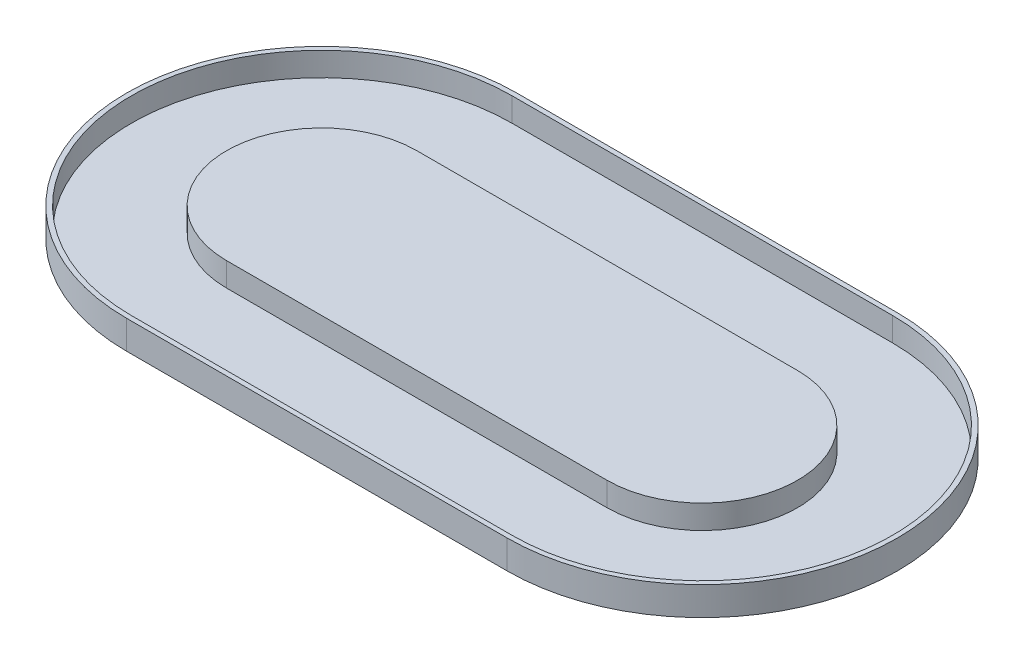
ISO-10303-21;
HEADER;
FILE_DESCRIPTION(('STEP AP214'),'2;1');
FILE_NAME('part.step','',(''),(''),'','','');
FILE_SCHEMA(('AUTOMOTIVE_DESIGN { 1 0 10303 214 1 1 1 1 }'));
ENDSEC;
DATA;
#1=APPLICATION_CONTEXT('core data for automotive mechanical design processes');
#2=APPLICATION_PROTOCOL_DEFINITION('international standard','automotive_design',2000,#1);
#3=PRODUCT_CONTEXT('',#1,'mechanical');
#4=PRODUCT('Part','Part','',(#3));
#5=PRODUCT_RELATED_PRODUCT_CATEGORY('part','',(#4));
#6=PRODUCT_DEFINITION_FORMATION('','',#4);
#7=PRODUCT_DEFINITION_CONTEXT('part definition',#1,'design');
#8=PRODUCT_DEFINITION('design','',#6,#7);
#9=PRODUCT_DEFINITION_SHAPE('','',#8);
#10=(LENGTH_UNIT() NAMED_UNIT(*) SI_UNIT(.MILLI.,.METRE.));
#11=(NAMED_UNIT(*) PLANE_ANGLE_UNIT() SI_UNIT($,.RADIAN.));
#12=(NAMED_UNIT(*) SI_UNIT($,.STERADIAN.) SOLID_ANGLE_UNIT());
#13=UNCERTAINTY_MEASURE_WITH_UNIT(LENGTH_MEASURE(1.E-05),#10,'distance_accuracy_value','');
#14=(GEOMETRIC_REPRESENTATION_CONTEXT(3) GLOBAL_UNCERTAINTY_ASSIGNED_CONTEXT((#13)) GLOBAL_UNIT_ASSIGNED_CONTEXT((#10,
#11,#12)) REPRESENTATION_CONTEXT('',''));
#15=CARTESIAN_POINT('',(0.,0.,0.));
#16=DIRECTION('',(0.,0.,1.));
#17=DIRECTION('',(1.,0.,0.));
#18=AXIS2_PLACEMENT_3D('',#15,#16,#17);
#19=CARTESIAN_POINT('',(-4000.,100.,0.));
#20=DIRECTION('',(0.,1.,0.));
#21=DIRECTION('',(0.,0.,1.));
#22=AXIS2_PLACEMENT_3D('',#19,#20,#21);
#23=PLANE('',#22);
#24=CARTESIAN_POINT('',(-4000.,100.,0.));
#25=DIRECTION('',(0.,1.,0.));
#26=DIRECTION('',(0.,0.,1.));
#27=AXIS2_PLACEMENT_3D('',#24,#25,#26);
#28=CIRCLE('',#27,4000.);
#29=CARTESIAN_POINT('',(-4000.,100.,-4000.));
#30=VERTEX_POINT('',#29);
#31=CARTESIAN_POINT('',(-4000.,100.,4000.));
#32=VERTEX_POINT('',#31);
#33=EDGE_CURVE('E262',#30,#32,#28,.T.);
#34=ORIENTED_EDGE('',*,*,#33,.T.);
#35=DIRECTION('',(1.,0.,0.));
#36=VECTOR('',#35,1.);
#37=CARTESIAN_POINT('',(-4000.,100.,4000.));
#38=LINE('',#37,#36);
#39=CARTESIAN_POINT('',(4000.,100.,4000.));
#40=VERTEX_POINT('',#39);
#41=EDGE_CURVE('E265',#32,#40,#38,.T.);
#42=ORIENTED_EDGE('',*,*,#41,.T.);
#43=CARTESIAN_POINT('',(4000.,100.,0.));
#44=DIRECTION('',(0.,1.,0.));
#45=DIRECTION('',(0.,0.,1.));
#46=AXIS2_PLACEMENT_3D('',#43,#44,#45);
#47=CIRCLE('',#46,4000.);
#48=CARTESIAN_POINT('',(4000.,100.,-4000.));
#49=VERTEX_POINT('',#48);
#50=EDGE_CURVE('E91',#40,#49,#47,.T.);
#51=ORIENTED_EDGE('',*,*,#50,.T.);
#52=DIRECTION('',(-1.,0.,0.));
#53=VECTOR('',#52,1.);
#54=CARTESIAN_POINT('',(-4000.,100.,-4000.));
#55=LINE('',#54,#53);
#56=EDGE_CURVE('E12',#49,#30,#55,.T.);
#57=ORIENTED_EDGE('',*,*,#56,.T.);
#58=EDGE_LOOP('',(#34,#42,#51,#57));
#59=FACE_BOUND('',#58,.T.);
#60=DIRECTION('',(-1.,0.,0.));
#61=VECTOR('',#60,1.);
#62=CARTESIAN_POINT('',(-4000.,100.,-2000.));
#63=LINE('',#62,#61);
#64=CARTESIAN_POINT('',(4000.,100.,-2000.));
#65=VERTEX_POINT('',#64);
#66=CARTESIAN_POINT('',(-4000.,100.,-2000.));
#67=VERTEX_POINT('',#66);
#68=EDGE_CURVE('E179',#65,#67,#63,.T.);
#69=ORIENTED_EDGE('',*,*,#68,.F.);
#70=CARTESIAN_POINT('',(4000.,100.,0.));
#71=DIRECTION('',(0.,1.,0.));
#72=DIRECTION('',(0.,0.,1.));
#73=AXIS2_PLACEMENT_3D('',#70,#71,#72);
#74=CIRCLE('',#73,2000.);
#75=CARTESIAN_POINT('',(4000.,100.,2000.));
#76=VERTEX_POINT('',#75);
#77=EDGE_CURVE('E250',#76,#65,#74,.T.);
#78=ORIENTED_EDGE('',*,*,#77,.F.);
#79=DIRECTION('',(1.,0.,0.));
#80=VECTOR('',#79,1.);
#81=CARTESIAN_POINT('',(-4000.,100.,2000.));
#82=LINE('',#81,#80);
#83=CARTESIAN_POINT('',(-4000.,100.,2000.));
#84=VERTEX_POINT('',#83);
#85=EDGE_CURVE('E98',#84,#76,#82,.T.);
#86=ORIENTED_EDGE('',*,*,#85,.F.);
#87=CARTESIAN_POINT('',(-4000.,100.,0.));
#88=DIRECTION('',(0.,1.,0.));
#89=DIRECTION('',(0.,0.,1.));
#90=AXIS2_PLACEMENT_3D('',#87,#88,#89);
#91=CIRCLE('',#90,2000.);
#92=EDGE_CURVE('E259',#67,#84,#91,.T.);
#93=ORIENTED_EDGE('',*,*,#92,.F.);
#94=EDGE_LOOP('',(#69,#78,#86,#93));
#95=FACE_BOUND('',#94,.T.);
#96=ADVANCED_FACE('F83',(#59,#95),#23,.T.);
#97=CARTESIAN_POINT('',(-4000.,0.,0.));
#98=DIRECTION('',(0.,1.,0.));
#99=DIRECTION('',(0.,0.,1.));
#100=AXIS2_PLACEMENT_3D('',#97,#98,#99);
#101=PLANE('',#100);
#102=CARTESIAN_POINT('',(4000.,0.,0.));
#103=DIRECTION('',(0.,1.,0.));
#104=DIRECTION('',(0.,0.,1.));
#105=AXIS2_PLACEMENT_3D('',#102,#103,#104);
#106=CIRCLE('',#105,4100.);
#107=CARTESIAN_POINT('',(4000.,0.,4100.));
#108=VERTEX_POINT('',#107);
#109=CARTESIAN_POINT('',(4000.,0.,-4100.));
#110=VERTEX_POINT('',#109);
#111=EDGE_CURVE('E231',#108,#110,#106,.T.);
#112=ORIENTED_EDGE('',*,*,#111,.F.);
#113=DIRECTION('',(1.,0.,0.));
#114=VECTOR('',#113,1.);
#115=CARTESIAN_POINT('',(-4000.,0.,4100.));
#116=LINE('',#115,#114);
#117=CARTESIAN_POINT('',(-4000.,0.,4100.));
#118=VERTEX_POINT('',#117);
#119=EDGE_CURVE('E244',#118,#108,#116,.T.);
#120=ORIENTED_EDGE('',*,*,#119,.F.);
#121=CARTESIAN_POINT('',(-4000.,0.,0.));
#122=DIRECTION('',(0.,1.,0.));
#123=DIRECTION('',(0.,0.,1.));
#124=AXIS2_PLACEMENT_3D('',#121,#122,#123);
#125=CIRCLE('',#124,4100.);
#126=CARTESIAN_POINT('',(-4000.,0.,-4100.));
#127=VERTEX_POINT('',#126);
#128=EDGE_CURVE('E241',#127,#118,#125,.T.);
#129=ORIENTED_EDGE('',*,*,#128,.F.);
#130=DIRECTION('',(-1.,0.,0.));
#131=VECTOR('',#130,1.);
#132=CARTESIAN_POINT('',(4000.,0.,-4100.));
#133=LINE('',#132,#131);
#134=EDGE_CURVE('E238',#110,#127,#133,.T.);
#135=ORIENTED_EDGE('',*,*,#134,.F.);
#136=EDGE_LOOP('',(#112,#120,#129,#135));
#137=FACE_BOUND('',#136,.T.);
#138=ADVANCED_FACE('F85',(#137),#101,.F.);
#139=CARTESIAN_POINT('',(4000.,0.,0.));
#140=DIRECTION('',(0.,1.,0.));
#141=DIRECTION('',(0.,0.,1.));
#142=AXIS2_PLACEMENT_3D('',#139,#140,#141);
#143=CYLINDRICAL_SURFACE('',#142,4100.);
#144=DIRECTION('',(0.,1.,0.));
#145=VECTOR('',#144,1.);
#146=CARTESIAN_POINT('',(4000.,0.,-4100.));
#147=LINE('',#146,#145);
#148=CARTESIAN_POINT('',(4000.,600.,-4100.));
#149=VERTEX_POINT('',#148);
#150=EDGE_CURVE('E247',#110,#149,#147,.T.);
#151=ORIENTED_EDGE('',*,*,#150,.T.);
#152=CARTESIAN_POINT('',(4000.,600.,0.));
#153=DIRECTION('',(0.,1.,0.));
#154=DIRECTION('',(0.,0.,1.));
#155=AXIS2_PLACEMENT_3D('',#152,#153,#154);
#156=CIRCLE('',#155,4100.);
#157=CARTESIAN_POINT('',(4000.,600.,4100.));
#158=VERTEX_POINT('',#157);
#159=EDGE_CURVE('E216',#158,#149,#156,.T.);
#160=ORIENTED_EDGE('',*,*,#159,.F.);
#161=DIRECTION('',(0.,1.,0.));
#162=VECTOR('',#161,1.);
#163=CARTESIAN_POINT('',(4000.,0.,4100.));
#164=LINE('',#163,#162);
#165=EDGE_CURVE('E248',#108,#158,#164,.T.);
#166=ORIENTED_EDGE('',*,*,#165,.F.);
#167=ORIENTED_EDGE('',*,*,#111,.T.);
#168=EDGE_LOOP('',(#151,#160,#166,#167));
#169=FACE_BOUND('',#168,.T.);
#170=ADVANCED_FACE('F301',(#169),#143,.T.);
#171=CARTESIAN_POINT('',(-4000.,0.,4100.));
#172=DIRECTION('',(0.,0.,1.));
#173=DIRECTION('',(1.,0.,0.));
#174=AXIS2_PLACEMENT_3D('',#171,#172,#173);
#175=PLANE('',#174);
#176=ORIENTED_EDGE('',*,*,#165,.T.);
#177=DIRECTION('',(1.,0.,0.));
#178=VECTOR('',#177,1.);
#179=CARTESIAN_POINT('',(-4000.,600.,4100.));
#180=LINE('',#179,#178);
#181=CARTESIAN_POINT('',(-4000.,600.,4100.));
#182=VERTEX_POINT('',#181);
#183=EDGE_CURVE('E225',#182,#158,#180,.T.);
#184=ORIENTED_EDGE('',*,*,#183,.F.);
#185=DIRECTION('',(0.,1.,0.));
#186=VECTOR('',#185,1.);
#187=CARTESIAN_POINT('',(-4000.,0.,4100.));
#188=LINE('',#187,#186);
#189=EDGE_CURVE('E251',#118,#182,#188,.T.);
#190=ORIENTED_EDGE('',*,*,#189,.F.);
#191=ORIENTED_EDGE('',*,*,#119,.T.);
#192=EDGE_LOOP('',(#176,#184,#190,#191));
#193=FACE_BOUND('',#192,.T.);
#194=ADVANCED_FACE('F306',(#193),#175,.T.);
#195=CARTESIAN_POINT('',(-4000.,0.,0.));
#196=DIRECTION('',(0.,1.,0.));
#197=DIRECTION('',(0.,0.,1.));
#198=AXIS2_PLACEMENT_3D('',#195,#196,#197);
#199=CYLINDRICAL_SURFACE('',#198,4100.);
#200=ORIENTED_EDGE('',*,*,#189,.T.);
#201=CARTESIAN_POINT('',(-4000.,600.,0.));
#202=DIRECTION('',(0.,1.,0.));
#203=DIRECTION('',(0.,0.,1.));
#204=AXIS2_PLACEMENT_3D('',#201,#202,#203);
#205=CIRCLE('',#204,4100.);
#206=CARTESIAN_POINT('',(-4000.,600.,-4100.));
#207=VERTEX_POINT('',#206);
#208=EDGE_CURVE('E222',#207,#182,#205,.T.);
#209=ORIENTED_EDGE('',*,*,#208,.F.);
#210=DIRECTION('',(0.,1.,0.));
#211=VECTOR('',#210,1.);
#212=CARTESIAN_POINT('',(-4000.,0.,-4100.));
#213=LINE('',#212,#211);
#214=EDGE_CURVE('E253',#127,#207,#213,.T.);
#215=ORIENTED_EDGE('',*,*,#214,.F.);
#216=ORIENTED_EDGE('',*,*,#128,.T.);
#217=EDGE_LOOP('',(#200,#209,#215,#216));
#218=FACE_BOUND('',#217,.T.);
#219=ADVANCED_FACE('F311',(#218),#199,.T.);
#220=CARTESIAN_POINT('',(4000.,0.,-4100.));
#221=DIRECTION('',(0.,0.,-1.));
#222=DIRECTION('',(-1.,0.,0.));
#223=AXIS2_PLACEMENT_3D('',#220,#221,#222);
#224=PLANE('',#223);
#225=ORIENTED_EDGE('',*,*,#214,.T.);
#226=DIRECTION('',(-1.,0.,0.));
#227=VECTOR('',#226,1.);
#228=CARTESIAN_POINT('',(4000.,600.,-4100.));
#229=LINE('',#228,#227);
#230=EDGE_CURVE('E219',#149,#207,#229,.T.);
#231=ORIENTED_EDGE('',*,*,#230,.F.);
#232=ORIENTED_EDGE('',*,*,#150,.F.);
#233=ORIENTED_EDGE('',*,*,#134,.T.);
#234=EDGE_LOOP('',(#225,#231,#232,#233));
#235=FACE_BOUND('',#234,.T.);
#236=ADVANCED_FACE('F308',(#235),#224,.T.);
#237=CARTESIAN_POINT('',(-4000.,0.,0.));
#238=DIRECTION('',(0.,1.,0.));
#239=DIRECTION('',(0.,0.,1.));
#240=AXIS2_PLACEMENT_3D('',#237,#238,#239);
#241=CYLINDRICAL_SURFACE('',#240,4000.);
#242=ORIENTED_EDGE('',*,*,#33,.F.);
#243=DIRECTION('',(0.,1.,0.));
#244=VECTOR('',#243,1.);
#245=CARTESIAN_POINT('',(-4000.,0.,-4000.));
#246=LINE('',#245,#244);
#247=CARTESIAN_POINT('',(-4000.,600.,-4000.));
#248=VERTEX_POINT('',#247);
#249=EDGE_CURVE('E229',#30,#248,#246,.T.);
#250=ORIENTED_EDGE('',*,*,#249,.T.);
#251=CARTESIAN_POINT('',(-4000.,600.,0.));
#252=DIRECTION('',(0.,1.,0.));
#253=DIRECTION('',(0.,0.,1.));
#254=AXIS2_PLACEMENT_3D('',#251,#252,#253);
#255=CIRCLE('',#254,4000.);
#256=CARTESIAN_POINT('',(-4000.,600.,4000.));
#257=VERTEX_POINT('',#256);
#258=EDGE_CURVE('E202',#248,#257,#255,.T.);
#259=ORIENTED_EDGE('',*,*,#258,.T.);
#260=DIRECTION('',(0.,1.,0.));
#261=VECTOR('',#260,1.);
#262=CARTESIAN_POINT('',(-4000.,0.,4000.));
#263=LINE('',#262,#261);
#264=EDGE_CURVE('E228',#32,#257,#263,.T.);
#265=ORIENTED_EDGE('',*,*,#264,.F.);
#266=EDGE_LOOP('',(#242,#250,#259,#265));
#267=FACE_BOUND('',#266,.T.);
#268=ADVANCED_FACE('F279',(#267),#241,.F.);
#269=CARTESIAN_POINT('',(4000.,0.,-4000.));
#270=DIRECTION('',(0.,0.,-1.));
#271=DIRECTION('',(-1.,0.,0.));
#272=AXIS2_PLACEMENT_3D('',#269,#270,#271);
#273=PLANE('',#272);
#274=ORIENTED_EDGE('',*,*,#56,.F.);
#275=DIRECTION('',(0.,1.,0.));
#276=VECTOR('',#275,1.);
#277=CARTESIAN_POINT('',(4000.,0.,-4000.));
#278=LINE('',#277,#276);
#279=CARTESIAN_POINT('',(4000.,600.,-4000.));
#280=VERTEX_POINT('',#279);
#281=EDGE_CURVE('E232',#49,#280,#278,.T.);
#282=ORIENTED_EDGE('',*,*,#281,.T.);
#283=DIRECTION('',(-1.,0.,0.));
#284=VECTOR('',#283,1.);
#285=CARTESIAN_POINT('',(4000.,600.,-4000.));
#286=LINE('',#285,#284);
#287=EDGE_CURVE('E213',#280,#248,#286,.T.);
#288=ORIENTED_EDGE('',*,*,#287,.T.);
#289=ORIENTED_EDGE('',*,*,#249,.F.);
#290=EDGE_LOOP('',(#274,#282,#288,#289));
#291=FACE_BOUND('',#290,.T.);
#292=ADVANCED_FACE('F275',(#291),#273,.F.);
#293=CARTESIAN_POINT('',(4000.,0.,0.));
#294=DIRECTION('',(0.,1.,0.));
#295=DIRECTION('',(0.,0.,1.));
#296=AXIS2_PLACEMENT_3D('',#293,#294,#295);
#297=CYLINDRICAL_SURFACE('',#296,4000.);
#298=ORIENTED_EDGE('',*,*,#50,.F.);
#299=DIRECTION('',(0.,1.,0.));
#300=VECTOR('',#299,1.);
#301=CARTESIAN_POINT('',(4000.,0.,4000.));
#302=LINE('',#301,#300);
#303=CARTESIAN_POINT('',(4000.,600.,4000.));
#304=VERTEX_POINT('',#303);
#305=EDGE_CURVE('E106',#40,#304,#302,.T.);
#306=ORIENTED_EDGE('',*,*,#305,.T.);
#307=CARTESIAN_POINT('',(4000.,600.,0.));
#308=DIRECTION('',(0.,1.,0.));
#309=DIRECTION('',(0.,0.,1.));
#310=AXIS2_PLACEMENT_3D('',#307,#308,#309);
#311=CIRCLE('',#310,4000.);
#312=EDGE_CURVE('E210',#304,#280,#311,.T.);
#313=ORIENTED_EDGE('',*,*,#312,.T.);
#314=ORIENTED_EDGE('',*,*,#281,.F.);
#315=EDGE_LOOP('',(#298,#306,#313,#314));
#316=FACE_BOUND('',#315,.T.);
#317=ADVANCED_FACE('F271',(#316),#297,.F.);
#318=CARTESIAN_POINT('',(-4000.,0.,4000.));
#319=DIRECTION('',(0.,0.,1.));
#320=DIRECTION('',(1.,0.,0.));
#321=AXIS2_PLACEMENT_3D('',#318,#319,#320);
#322=PLANE('',#321);
#323=ORIENTED_EDGE('',*,*,#41,.F.);
#324=ORIENTED_EDGE('',*,*,#264,.T.);
#325=DIRECTION('',(1.,0.,0.));
#326=VECTOR('',#325,1.);
#327=CARTESIAN_POINT('',(-4000.,600.,4000.));
#328=LINE('',#327,#326);
#329=EDGE_CURVE('E208',#257,#304,#328,.T.);
#330=ORIENTED_EDGE('',*,*,#329,.T.);
#331=ORIENTED_EDGE('',*,*,#305,.F.);
#332=EDGE_LOOP('',(#323,#324,#330,#331));
#333=FACE_BOUND('',#332,.T.);
#334=ADVANCED_FACE('F282',(#333),#322,.F.);
#335=CARTESIAN_POINT('',(4000.,600.,0.));
#336=DIRECTION('',(0.,1.,0.));
#337=DIRECTION('',(0.,0.,1.));
#338=AXIS2_PLACEMENT_3D('',#335,#336,#337);
#339=PLANE('',#338);
#340=ORIENTED_EDGE('',*,*,#159,.T.);
#341=ORIENTED_EDGE('',*,*,#230,.T.);
#342=ORIENTED_EDGE('',*,*,#208,.T.);
#343=ORIENTED_EDGE('',*,*,#183,.T.);
#344=EDGE_LOOP('',(#340,#341,#342,#343));
#345=FACE_BOUND('',#344,.T.);
#346=ORIENTED_EDGE('',*,*,#329,.F.);
#347=ORIENTED_EDGE('',*,*,#258,.F.);
#348=ORIENTED_EDGE('',*,*,#287,.F.);
#349=ORIENTED_EDGE('',*,*,#312,.F.);
#350=EDGE_LOOP('',(#346,#347,#348,#349));
#351=FACE_BOUND('',#350,.T.);
#352=ADVANCED_FACE('F284',(#345,#351),#339,.T.);
#353=CARTESIAN_POINT('',(0.,600.,0.));
#354=DIRECTION('',(0.,1.,0.));
#355=DIRECTION('',(0.,0.,1.));
#356=AXIS2_PLACEMENT_3D('',#353,#354,#355);
#357=PLANE('',#356);
#358=DIRECTION('',(1.,0.,0.));
#359=VECTOR('',#358,1.);
#360=CARTESIAN_POINT('',(0.,600.,-2000.));
#361=LINE('',#360,#359);
#362=CARTESIAN_POINT('',(-4000.,600.,-2000.));
#363=VERTEX_POINT('',#362);
#364=CARTESIAN_POINT('',(4000.,600.,-2000.));
#365=VERTEX_POINT('',#364);
#366=EDGE_CURVE('E177',#363,#365,#361,.T.);
#367=ORIENTED_EDGE('',*,*,#366,.F.);
#368=CARTESIAN_POINT('',(-4000.,600.,0.));
#369=DIRECTION('',(0.,1.,0.));
#370=DIRECTION('',(0.,0.,1.));
#371=AXIS2_PLACEMENT_3D('',#368,#369,#370);
#372=CIRCLE('',#371,2000.);
#373=CARTESIAN_POINT('',(-4000.,600.,2000.));
#374=VERTEX_POINT('',#373);
#375=EDGE_CURVE('E189',#374,#363,#372,.F.);
#376=ORIENTED_EDGE('',*,*,#375,.F.);
#377=DIRECTION('',(-1.,0.,0.));
#378=VECTOR('',#377,1.);
#379=CARTESIAN_POINT('',(0.,600.,2000.));
#380=LINE('',#379,#378);
#381=CARTESIAN_POINT('',(4000.,600.,2000.));
#382=VERTEX_POINT('',#381);
#383=EDGE_CURVE('E195',#382,#374,#380,.T.);
#384=ORIENTED_EDGE('',*,*,#383,.F.);
#385=CARTESIAN_POINT('',(4000.,600.,0.));
#386=DIRECTION('',(0.,1.,0.));
#387=DIRECTION('',(0.,0.,1.));
#388=AXIS2_PLACEMENT_3D('',#385,#386,#387);
#389=CIRCLE('',#388,2000.);
#390=EDGE_CURVE('E183',#365,#382,#389,.F.);
#391=ORIENTED_EDGE('',*,*,#390,.F.);
#392=EDGE_LOOP('',(#367,#376,#384,#391));
#393=FACE_BOUND('',#392,.T.);
#394=ADVANCED_FACE('F187',(#393),#357,.T.);
#395=CARTESIAN_POINT('',(0.,0.,-2000.));
#396=DIRECTION('',(0.,0.,1.));
#397=DIRECTION('',(1.,0.,0.));
#398=AXIS2_PLACEMENT_3D('',#395,#396,#397);
#399=PLANE('',#398);
#400=ORIENTED_EDGE('',*,*,#68,.T.);
#401=DIRECTION('',(0.,1.,0.));
#402=VECTOR('',#401,1.);
#403=CARTESIAN_POINT('',(-4000.,0.,-2000.));
#404=LINE('',#403,#402);
#405=EDGE_CURVE('E173',#67,#363,#404,.T.);
#406=ORIENTED_EDGE('',*,*,#405,.T.);
#407=ORIENTED_EDGE('',*,*,#366,.T.);
#408=DIRECTION('',(0.,1.,0.));
#409=VECTOR('',#408,1.);
#410=CARTESIAN_POINT('',(4000.,0.,-2000.));
#411=LINE('',#410,#409);
#412=EDGE_CURVE('E200',#65,#365,#411,.T.);
#413=ORIENTED_EDGE('',*,*,#412,.F.);
#414=EDGE_LOOP('',(#400,#406,#407,#413));
#415=FACE_BOUND('',#414,.T.);
#416=ADVANCED_FACE('F175',(#415),#399,.F.);
#417=CARTESIAN_POINT('',(-4000.,0.,0.));
#418=DIRECTION('',(0.,1.,0.));
#419=DIRECTION('',(0.,0.,1.));
#420=AXIS2_PLACEMENT_3D('',#417,#418,#419);
#421=CYLINDRICAL_SURFACE('',#420,2000.);
#422=ORIENTED_EDGE('',*,*,#92,.T.);
#423=DIRECTION('',(0.,1.,0.));
#424=VECTOR('',#423,1.);
#425=CARTESIAN_POINT('',(-4000.,0.,2000.));
#426=LINE('',#425,#424);
#427=EDGE_CURVE('E182',#84,#374,#426,.T.);
#428=ORIENTED_EDGE('',*,*,#427,.T.);
#429=ORIENTED_EDGE('',*,*,#375,.T.);
#430=ORIENTED_EDGE('',*,*,#405,.F.);
#431=EDGE_LOOP('',(#422,#428,#429,#430));
#432=FACE_BOUND('',#431,.T.);
#433=ADVANCED_FACE('F193',(#432),#421,.T.);
#434=CARTESIAN_POINT('',(0.,0.,2000.));
#435=DIRECTION('',(0.,0.,-1.));
#436=DIRECTION('',(-1.,0.,0.));
#437=AXIS2_PLACEMENT_3D('',#434,#435,#436);
#438=PLANE('',#437);
#439=ORIENTED_EDGE('',*,*,#85,.T.);
#440=DIRECTION('',(0.,1.,0.));
#441=VECTOR('',#440,1.);
#442=CARTESIAN_POINT('',(4000.,0.,2000.));
#443=LINE('',#442,#441);
#444=EDGE_CURVE('E203',#76,#382,#443,.T.);
#445=ORIENTED_EDGE('',*,*,#444,.T.);
#446=ORIENTED_EDGE('',*,*,#383,.T.);
#447=ORIENTED_EDGE('',*,*,#427,.F.);
#448=EDGE_LOOP('',(#439,#445,#446,#447));
#449=FACE_BOUND('',#448,.T.);
#450=ADVANCED_FACE('F376',(#449),#438,.F.);
#451=CARTESIAN_POINT('',(4000.,0.,0.));
#452=DIRECTION('',(0.,1.,0.));
#453=DIRECTION('',(0.,0.,1.));
#454=AXIS2_PLACEMENT_3D('',#451,#452,#453);
#455=CYLINDRICAL_SURFACE('',#454,2000.);
#456=ORIENTED_EDGE('',*,*,#77,.T.);
#457=ORIENTED_EDGE('',*,*,#412,.T.);
#458=ORIENTED_EDGE('',*,*,#390,.T.);
#459=ORIENTED_EDGE('',*,*,#444,.F.);
#460=EDGE_LOOP('',(#456,#457,#458,#459));
#461=FACE_BOUND('',#460,.T.);
#462=ADVANCED_FACE('F387',(#461),#455,.T.);
#463=CLOSED_SHELL('',(#96,#138,#170,#194,#219,#236,#268,#292,#317,#334,#352,#394,#416,#433,#450,#462));
#464=MANIFOLD_SOLID_BREP('B2',#463);
#465=ADVANCED_BREP_SHAPE_REPRESENTATION('',(#18,#464),#14);
#466=SHAPE_DEFINITION_REPRESENTATION(#9,#465);
ENDSEC;
END-ISO-10303-21;
